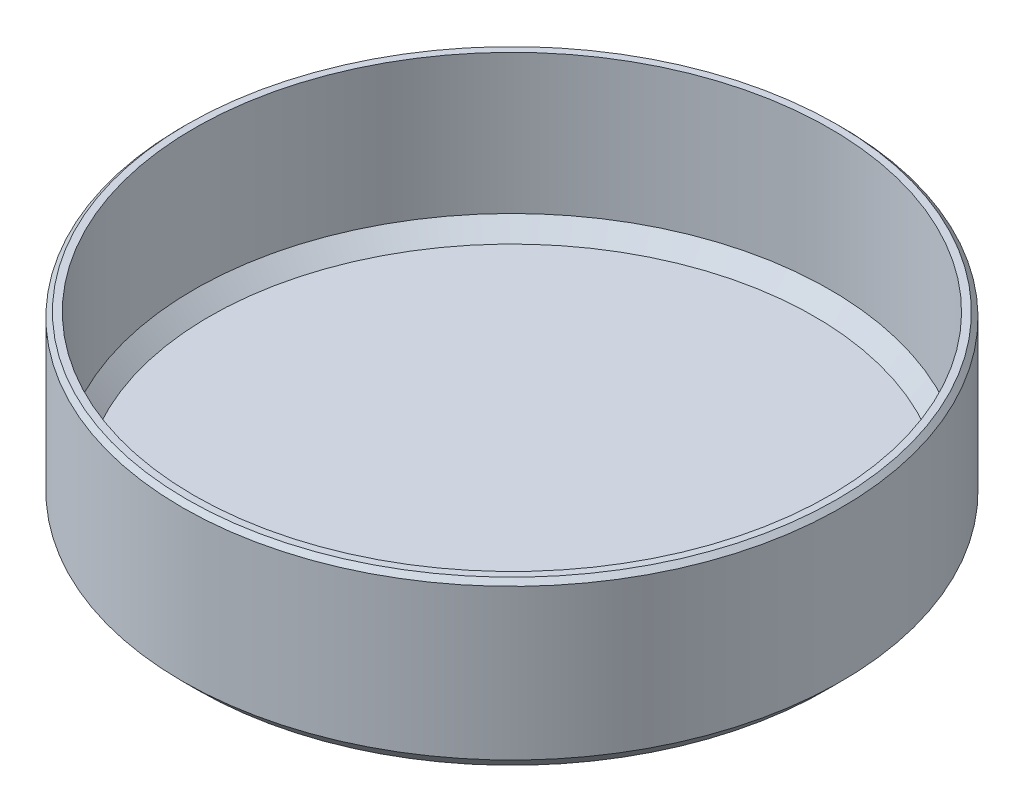
ISO-10303-21;
HEADER;
FILE_DESCRIPTION(('STEP AP214'),'2;1');
FILE_NAME('part.step','',(''),(''),'','','');
FILE_SCHEMA(('AUTOMOTIVE_DESIGN { 1 0 10303 214 1 1 1 1 }'));
ENDSEC;
DATA;
#1=APPLICATION_CONTEXT('core data for automotive mechanical design processes');
#2=APPLICATION_PROTOCOL_DEFINITION('international standard','automotive_design',2000,#1);
#3=PRODUCT_CONTEXT('',#1,'mechanical');
#4=PRODUCT('Part','Part','',(#3));
#5=PRODUCT_RELATED_PRODUCT_CATEGORY('part','',(#4));
#6=PRODUCT_DEFINITION_FORMATION('','',#4);
#7=PRODUCT_DEFINITION_CONTEXT('part definition',#1,'design');
#8=PRODUCT_DEFINITION('design','',#6,#7);
#9=PRODUCT_DEFINITION_SHAPE('','',#8);
#10=(LENGTH_UNIT() NAMED_UNIT(*) SI_UNIT(.MILLI.,.METRE.));
#11=(NAMED_UNIT(*) PLANE_ANGLE_UNIT() SI_UNIT($,.RADIAN.));
#12=(NAMED_UNIT(*) SI_UNIT($,.STERADIAN.) SOLID_ANGLE_UNIT());
#13=UNCERTAINTY_MEASURE_WITH_UNIT(LENGTH_MEASURE(1.E-05),#10,'distance_accuracy_value','');
#14=(GEOMETRIC_REPRESENTATION_CONTEXT(3) GLOBAL_UNCERTAINTY_ASSIGNED_CONTEXT((#13)) GLOBAL_UNIT_ASSIGNED_CONTEXT((#10,
#11,#12)) REPRESENTATION_CONTEXT('',''));
#15=CARTESIAN_POINT('',(0.,0.,0.));
#16=DIRECTION('',(0.,0.,1.));
#17=DIRECTION('',(1.,0.,0.));
#18=AXIS2_PLACEMENT_3D('',#15,#16,#17);
#19=CARTESIAN_POINT('',(0.,2.,0.));
#20=DIRECTION('',(0.,-1.,0.));
#21=DIRECTION('',(0.,0.,-1.));
#22=AXIS2_PLACEMENT_3D('',#19,#20,#21);
#23=CYLINDRICAL_SURFACE('',#22,42.5);
#24=CARTESIAN_POINT('',(0.,21.4,0.));
#25=DIRECTION('',(0.,1.,0.));
#26=DIRECTION('',(0.,0.,1.));
#27=AXIS2_PLACEMENT_3D('',#24,#25,#26);
#28=CIRCLE('',#27,42.5);
#29=CARTESIAN_POINT('',(0.,21.4,42.5));
#30=VERTEX_POINT('',#29);
#31=EDGE_CURVE('E10',#30,#30,#28,.F.);
#32=ORIENTED_EDGE('',*,*,#31,.T.);
#33=EDGE_LOOP('',(#32));
#34=FACE_BOUND('',#33,.T.);
#35=CARTESIAN_POINT('',(0.,2.00000000000001,0.));
#36=DIRECTION('',(0.,1.,0.));
#37=DIRECTION('',(0.,0.,1.));
#38=AXIS2_PLACEMENT_3D('',#35,#36,#37);
#39=CIRCLE('',#38,42.5);
#40=CARTESIAN_POINT('',(0.,2.00000000000001,42.5));
#41=VERTEX_POINT('',#40);
#42=EDGE_CURVE('E46',#41,#41,#39,.T.);
#43=ORIENTED_EDGE('',*,*,#42,.T.);
#44=EDGE_LOOP('',(#43));
#45=FACE_BOUND('',#44,.T.);
#46=ADVANCED_FACE('F31',(#34,#45),#23,.T.);
#47=CARTESIAN_POINT('',(0.,0.,0.));
#48=DIRECTION('',(0.,1.,0.));
#49=DIRECTION('',(0.,0.,1.));
#50=AXIS2_PLACEMENT_3D('',#47,#48,#49);
#51=PLANE('',#50);
#52=CARTESIAN_POINT('',(0.,0.,0.));
#53=DIRECTION('',(0.,1.,0.));
#54=DIRECTION('',(0.,0.,1.));
#55=AXIS2_PLACEMENT_3D('',#52,#53,#54);
#56=CIRCLE('',#55,40.5);
#57=CARTESIAN_POINT('',(0.,0.,40.5));
#58=VERTEX_POINT('',#57);
#59=EDGE_CURVE('E42',#58,#58,#56,.F.);
#60=ORIENTED_EDGE('',*,*,#59,.T.);
#61=EDGE_LOOP('',(#60));
#62=FACE_BOUND('',#61,.T.);
#63=ADVANCED_FACE('F65',(#62),#51,.F.);
#64=CARTESIAN_POINT('',(0.,22.,0.));
#65=DIRECTION('',(0.,1.,0.));
#66=DIRECTION('',(0.,0.,1.));
#67=AXIS2_PLACEMENT_3D('',#64,#65,#66);
#68=PLANE('',#67);
#69=CARTESIAN_POINT('',(0.,22.,0.));
#70=DIRECTION('',(0.,1.,0.));
#71=DIRECTION('',(0.,0.,1.));
#72=AXIS2_PLACEMENT_3D('',#69,#70,#71);
#73=CIRCLE('',#72,41.9);
#74=CARTESIAN_POINT('',(0.,22.,41.9));
#75=VERTEX_POINT('',#74);
#76=EDGE_CURVE('E38',#75,#75,#73,.T.);
#77=ORIENTED_EDGE('',*,*,#76,.T.);
#78=EDGE_LOOP('',(#77));
#79=FACE_BOUND('',#78,.T.);
#80=CARTESIAN_POINT('',(0.,22.,0.));
#81=DIRECTION('',(0.,1.,0.));
#82=DIRECTION('',(0.,0.,1.));
#83=AXIS2_PLACEMENT_3D('',#80,#81,#82);
#84=CIRCLE('',#83,41.);
#85=CARTESIAN_POINT('',(0.,22.,41.));
#86=VERTEX_POINT('',#85);
#87=EDGE_CURVE('E57',#86,#86,#84,.T.);
#88=ORIENTED_EDGE('',*,*,#87,.F.);
#89=EDGE_LOOP('',(#88));
#90=FACE_BOUND('',#89,.T.);
#91=ADVANCED_FACE('F63',(#79,#90),#68,.T.);
#92=CARTESIAN_POINT('',(0.,22.,0.));
#93=DIRECTION('',(0.,-1.,0.));
#94=DIRECTION('',(0.,0.,-1.));
#95=AXIS2_PLACEMENT_3D('',#92,#93,#94);
#96=CYLINDRICAL_SURFACE('',#95,41.);
#97=CARTESIAN_POINT('',(0.,4.00000000000005,0.));
#98=DIRECTION('',(0.,1.,0.));
#99=DIRECTION('',(0.,0.,1.));
#100=AXIS2_PLACEMENT_3D('',#97,#98,#99);
#101=CIRCLE('',#100,41.);
#102=CARTESIAN_POINT('',(0.,4.00000000000005,41.));
#103=VERTEX_POINT('',#102);
#104=EDGE_CURVE('E54',#103,#103,#101,.F.);
#105=ORIENTED_EDGE('',*,*,#104,.T.);
#106=EDGE_LOOP('',(#105));
#107=FACE_BOUND('',#106,.T.);
#108=ORIENTED_EDGE('',*,*,#87,.T.);
#109=EDGE_LOOP('',(#108));
#110=FACE_BOUND('',#109,.T.);
#111=ADVANCED_FACE('F61',(#107,#110),#96,.F.);
#112=CARTESIAN_POINT('',(0.,2.,0.));
#113=DIRECTION('',(0.,1.,0.));
#114=DIRECTION('',(0.,0.,1.));
#115=AXIS2_PLACEMENT_3D('',#112,#113,#114);
#116=PLANE('',#115);
#117=CARTESIAN_POINT('',(0.,2.,0.));
#118=DIRECTION('',(0.,1.,0.));
#119=DIRECTION('',(0.,0.,1.));
#120=AXIS2_PLACEMENT_3D('',#117,#118,#119);
#121=CIRCLE('',#120,39.);
#122=CARTESIAN_POINT('',(0.,2.,39.));
#123=VERTEX_POINT('',#122);
#124=EDGE_CURVE('E51',#123,#123,#121,.T.);
#125=ORIENTED_EDGE('',*,*,#124,.T.);
#126=EDGE_LOOP('',(#125));
#127=FACE_BOUND('',#126,.T.);
#128=ADVANCED_FACE('F71',(#127),#116,.T.);
#129=CARTESIAN_POINT('',(0.,4.00000000000005,0.));
#130=DIRECTION('',(0.,1.,0.));
#131=DIRECTION('',(0.,0.,1.));
#132=AXIS2_PLACEMENT_3D('',#129,#130,#131);
#133=CONICAL_SURFACE('',#132,41.,0.785398163397443);
#134=ORIENTED_EDGE('',*,*,#124,.F.);
#135=EDGE_LOOP('',(#134));
#136=FACE_BOUND('',#135,.T.);
#137=ORIENTED_EDGE('',*,*,#104,.F.);
#138=EDGE_LOOP('',(#137));
#139=FACE_BOUND('',#138,.T.);
#140=ADVANCED_FACE('F83',(#136,#139),#133,.F.);
#141=CARTESIAN_POINT('',(0.,2.00000000000001,0.));
#142=DIRECTION('',(0.,1.,0.));
#143=DIRECTION('',(0.,0.,1.));
#144=AXIS2_PLACEMENT_3D('',#141,#142,#143);
#145=CONICAL_SURFACE('',#144,42.5,0.78539816339745);
#146=ORIENTED_EDGE('',*,*,#59,.F.);
#147=EDGE_LOOP('',(#146));
#148=FACE_BOUND('',#147,.T.);
#149=ORIENTED_EDGE('',*,*,#42,.F.);
#150=EDGE_LOOP('',(#149));
#151=FACE_BOUND('',#150,.T.);
#152=ADVANCED_FACE('F85',(#148,#151),#145,.T.);
#153=CARTESIAN_POINT('',(0.,22.,0.));
#154=DIRECTION('',(0.,-1.,0.));
#155=DIRECTION('',(0.,0.,-1.));
#156=AXIS2_PLACEMENT_3D('',#153,#154,#155);
#157=CONICAL_SURFACE('',#156,41.9,0.785398163397443);
#158=ORIENTED_EDGE('',*,*,#31,.F.);
#159=EDGE_LOOP('',(#158));
#160=FACE_BOUND('',#159,.T.);
#161=ORIENTED_EDGE('',*,*,#76,.F.);
#162=EDGE_LOOP('',(#161));
#163=FACE_BOUND('',#162,.T.);
#164=ADVANCED_FACE('F33',(#160,#163),#157,.T.);
#165=CLOSED_SHELL('',(#46,#63,#91,#111,#128,#140,#152,#164));
#166=MANIFOLD_SOLID_BREP('B2',#165);
#167=ADVANCED_BREP_SHAPE_REPRESENTATION('',(#18,#166),#14);
#168=SHAPE_DEFINITION_REPRESENTATION(#9,#167);
ENDSEC;
END-ISO-10303-21;
